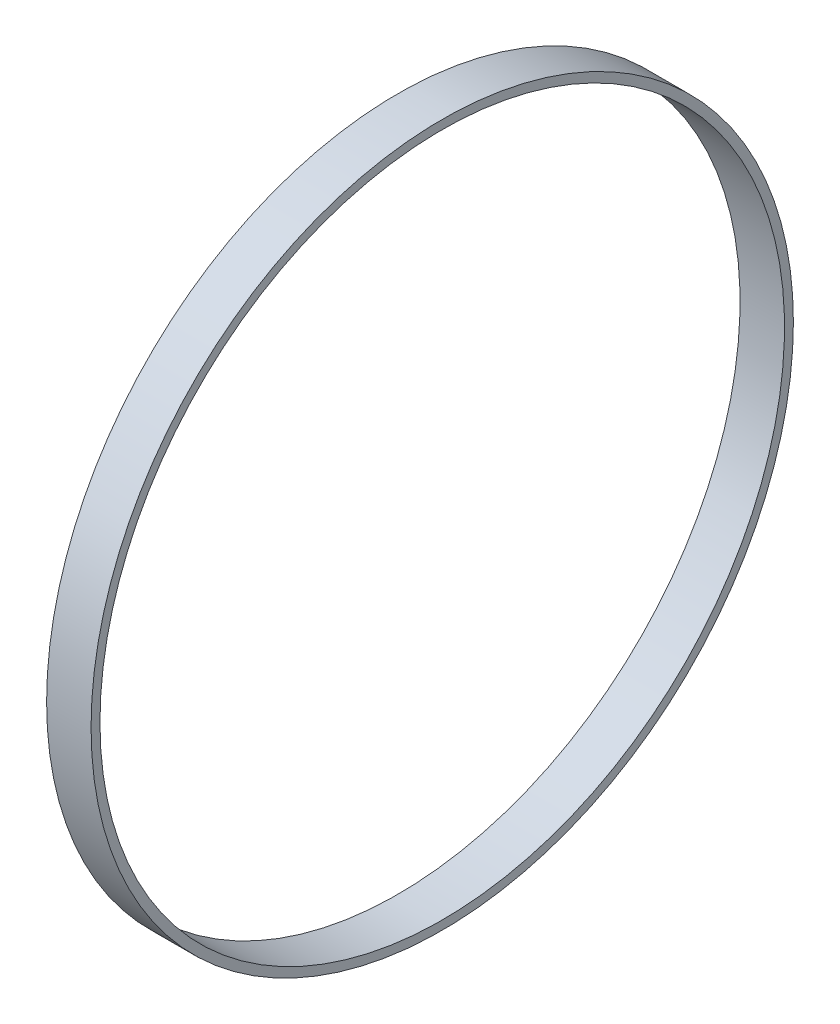
ISO-10303-21;
HEADER;
FILE_DESCRIPTION(('STEP AP214'),'2;1');
FILE_NAME('part.step','',(''),(''),'','','');
FILE_SCHEMA(('AUTOMOTIVE_DESIGN { 1 0 10303 214 1 1 1 1 }'));
ENDSEC;
DATA;
#1=APPLICATION_CONTEXT('core data for automotive mechanical design processes');
#2=APPLICATION_PROTOCOL_DEFINITION('international standard','automotive_design',2000,#1);
#3=PRODUCT_CONTEXT('',#1,'mechanical');
#4=PRODUCT('Part','Part','',(#3));
#5=PRODUCT_RELATED_PRODUCT_CATEGORY('part','',(#4));
#6=PRODUCT_DEFINITION_FORMATION('','',#4);
#7=PRODUCT_DEFINITION_CONTEXT('part definition',#1,'design');
#8=PRODUCT_DEFINITION('design','',#6,#7);
#9=PRODUCT_DEFINITION_SHAPE('','',#8);
#10=(LENGTH_UNIT() NAMED_UNIT(*) SI_UNIT(.MILLI.,.METRE.));
#11=(NAMED_UNIT(*) PLANE_ANGLE_UNIT() SI_UNIT($,.RADIAN.));
#12=(NAMED_UNIT(*) SI_UNIT($,.STERADIAN.) SOLID_ANGLE_UNIT());
#13=UNCERTAINTY_MEASURE_WITH_UNIT(LENGTH_MEASURE(1.E-05),#10,'distance_accuracy_value','');
#14=(GEOMETRIC_REPRESENTATION_CONTEXT(3) GLOBAL_UNCERTAINTY_ASSIGNED_CONTEXT((#13)) GLOBAL_UNIT_ASSIGNED_CONTEXT((#10,
#11,#12)) REPRESENTATION_CONTEXT('',''));
#15=CARTESIAN_POINT('',(0.,0.,0.));
#16=DIRECTION('',(0.,0.,1.));
#17=DIRECTION('',(1.,0.,0.));
#18=AXIS2_PLACEMENT_3D('',#15,#16,#17);
#19=CARTESIAN_POINT('',(25.,0.,4.99999999999999));
#20=DIRECTION('',(-1.,0.,0.));
#21=DIRECTION('',(0.,0.,1.));
#22=AXIS2_PLACEMENT_3D('',#19,#20,#21);
#23=PLANE('',#22);
#24=CARTESIAN_POINT('',(25.,0.,390.));
#25=DIRECTION('',(-1.,0.,0.));
#26=DIRECTION('',(0.,0.,1.));
#27=AXIS2_PLACEMENT_3D('',#24,#25,#26);
#28=CIRCLE('',#27,395.);
#29=CARTESIAN_POINT('',(25.,0.,785.));
#30=VERTEX_POINT('',#29);
#31=EDGE_CURVE('E45',#30,#30,#28,.T.);
#32=ORIENTED_EDGE('',*,*,#31,.F.);
#33=EDGE_LOOP('',(#32));
#34=FACE_BOUND('',#33,.T.);
#35=CARTESIAN_POINT('',(25.,0.,390.));
#36=DIRECTION('',(-1.,0.,0.));
#37=DIRECTION('',(0.,0.,1.));
#38=AXIS2_PLACEMENT_3D('',#35,#36,#37);
#39=CIRCLE('',#38,385.);
#40=CARTESIAN_POINT('',(25.,0.,775.));
#41=VERTEX_POINT('',#40);
#42=EDGE_CURVE('E10',#41,#41,#39,.T.);
#43=ORIENTED_EDGE('',*,*,#42,.T.);
#44=EDGE_LOOP('',(#43));
#45=FACE_BOUND('',#44,.T.);
#46=ADVANCED_FACE('F31',(#34,#45),#23,.F.);
#47=CARTESIAN_POINT('',(-20.7822875987443,0.,390.));
#48=DIRECTION('',(-1.,0.,0.));
#49=DIRECTION('',(0.,0.,1.));
#50=AXIS2_PLACEMENT_3D('',#47,#48,#49);
#51=CYLINDRICAL_SURFACE('',#50,385.);
#52=ORIENTED_EDGE('',*,*,#42,.F.);
#53=EDGE_LOOP('',(#52));
#54=FACE_BOUND('',#53,.T.);
#55=CARTESIAN_POINT('',(-25.,0.,390.));
#56=DIRECTION('',(-1.,0.,0.));
#57=DIRECTION('',(0.,0.,1.));
#58=AXIS2_PLACEMENT_3D('',#55,#56,#57);
#59=CIRCLE('',#58,385.);
#60=CARTESIAN_POINT('',(-25.,0.,775.));
#61=VERTEX_POINT('',#60);
#62=EDGE_CURVE('E37',#61,#61,#59,.T.);
#63=ORIENTED_EDGE('',*,*,#62,.T.);
#64=EDGE_LOOP('',(#63));
#65=FACE_BOUND('',#64,.T.);
#66=ADVANCED_FACE('F54',(#54,#65),#51,.F.);
#67=CARTESIAN_POINT('',(-25.,0.,4.99999999999999));
#68=DIRECTION('',(1.,0.,0.));
#69=DIRECTION('',(0.,0.,-1.));
#70=AXIS2_PLACEMENT_3D('',#67,#68,#69);
#71=PLANE('',#70);
#72=ORIENTED_EDGE('',*,*,#62,.F.);
#73=EDGE_LOOP('',(#72));
#74=FACE_BOUND('',#73,.T.);
#75=CARTESIAN_POINT('',(-25.,0.,390.));
#76=DIRECTION('',(-1.,0.,0.));
#77=DIRECTION('',(0.,0.,1.));
#78=AXIS2_PLACEMENT_3D('',#75,#76,#77);
#79=CIRCLE('',#78,395.);
#80=CARTESIAN_POINT('',(-25.,0.,785.));
#81=VERTEX_POINT('',#80);
#82=EDGE_CURVE('E41',#81,#81,#79,.T.);
#83=ORIENTED_EDGE('',*,*,#82,.T.);
#84=EDGE_LOOP('',(#83));
#85=FACE_BOUND('',#84,.T.);
#86=ADVANCED_FACE('F58',(#74,#85),#71,.F.);
#87=CARTESIAN_POINT('',(-20.7822875987443,0.,390.));
#88=DIRECTION('',(-1.,0.,0.));
#89=DIRECTION('',(0.,0.,1.));
#90=AXIS2_PLACEMENT_3D('',#87,#88,#89);
#91=CYLINDRICAL_SURFACE('',#90,395.);
#92=ORIENTED_EDGE('',*,*,#82,.F.);
#93=EDGE_LOOP('',(#92));
#94=FACE_BOUND('',#93,.T.);
#95=ORIENTED_EDGE('',*,*,#31,.T.);
#96=EDGE_LOOP('',(#95));
#97=FACE_BOUND('',#96,.T.);
#98=ADVANCED_FACE('F51',(#94,#97),#91,.T.);
#99=CLOSED_SHELL('',(#46,#66,#86,#98));
#100=MANIFOLD_SOLID_BREP('B2',#99);
#101=ADVANCED_BREP_SHAPE_REPRESENTATION('',(#18,#100),#14);
#102=SHAPE_DEFINITION_REPRESENTATION(#9,#101);
ENDSEC;
END-ISO-10303-21;
